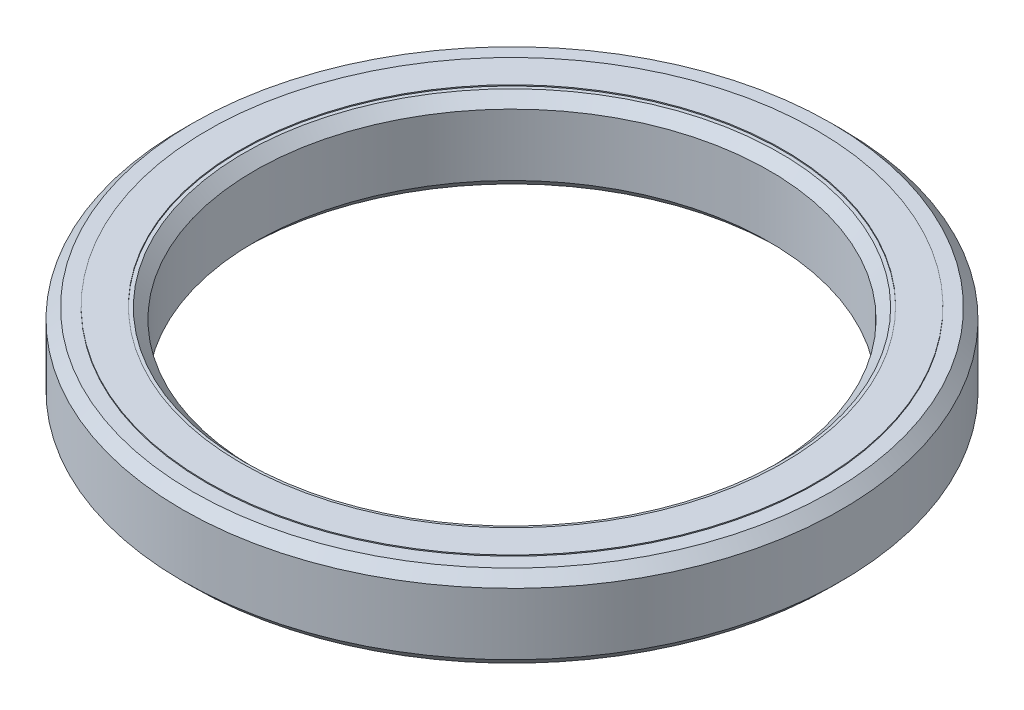
ISO-10303-21;
HEADER;
FILE_DESCRIPTION(('STEP AP214'),'2;1');
FILE_NAME('part.step','',(''),(''),'','','');
FILE_SCHEMA(('AUTOMOTIVE_DESIGN { 1 0 10303 214 1 1 1 1 }'));
ENDSEC;
DATA;
#1=APPLICATION_CONTEXT('core data for automotive mechanical design processes');
#2=APPLICATION_PROTOCOL_DEFINITION('international standard','automotive_design',2000,#1);
#3=PRODUCT_CONTEXT('',#1,'mechanical');
#4=PRODUCT('Part','Part','',(#3));
#5=PRODUCT_RELATED_PRODUCT_CATEGORY('part','',(#4));
#6=PRODUCT_DEFINITION_FORMATION('','',#4);
#7=PRODUCT_DEFINITION_CONTEXT('part definition',#1,'design');
#8=PRODUCT_DEFINITION('design','',#6,#7);
#9=PRODUCT_DEFINITION_SHAPE('','',#8);
#10=(LENGTH_UNIT() NAMED_UNIT(*) SI_UNIT(.MILLI.,.METRE.));
#11=(NAMED_UNIT(*) PLANE_ANGLE_UNIT() SI_UNIT($,.RADIAN.));
#12=(NAMED_UNIT(*) SI_UNIT($,.STERADIAN.) SOLID_ANGLE_UNIT());
#13=UNCERTAINTY_MEASURE_WITH_UNIT(LENGTH_MEASURE(1.E-05),#10,'distance_accuracy_value','');
#14=(GEOMETRIC_REPRESENTATION_CONTEXT(3) GLOBAL_UNCERTAINTY_ASSIGNED_CONTEXT((#13)) GLOBAL_UNIT_ASSIGNED_CONTEXT((#10,
#11,#12)) REPRESENTATION_CONTEXT('',''));
#15=CARTESIAN_POINT('',(0.,0.,0.));
#16=DIRECTION('',(0.,0.,1.));
#17=DIRECTION('',(1.,0.,0.));
#18=AXIS2_PLACEMENT_3D('',#15,#16,#17);
#19=CARTESIAN_POINT('',(0.,2.,0.));
#20=DIRECTION('',(0.,1.,0.));
#21=DIRECTION('',(0.,0.,1.));
#22=AXIS2_PLACEMENT_3D('',#19,#20,#21);
#23=PLANE('',#22);
#24=CARTESIAN_POINT('',(0.,2.,0.));
#25=DIRECTION('',(0.,1.,0.));
#26=DIRECTION('',(0.,0.,1.));
#27=AXIS2_PLACEMENT_3D('',#24,#25,#26);
#28=CIRCLE('',#27,14.7934604030925);
#29=CARTESIAN_POINT('',(0.,2.,14.7934604030925));
#30=VERTEX_POINT('',#29);
#31=EDGE_CURVE('E61',#30,#30,#28,.F.);
#32=ORIENTED_EDGE('',*,*,#31,.T.);
#33=EDGE_LOOP('',(#32));
#34=FACE_BOUND('',#33,.T.);
#35=CARTESIAN_POINT('',(0.,2.,0.));
#36=DIRECTION('',(0.,1.,0.));
#37=DIRECTION('',(0.,0.,1.));
#38=AXIS2_PLACEMENT_3D('',#35,#36,#37);
#39=CIRCLE('',#38,15.5);
#40=CARTESIAN_POINT('',(0.,2.,15.5));
#41=VERTEX_POINT('',#40);
#42=EDGE_CURVE('E82',#41,#41,#39,.T.);
#43=ORIENTED_EDGE('',*,*,#42,.T.);
#44=EDGE_LOOP('',(#43));
#45=FACE_BOUND('',#44,.T.);
#46=ADVANCED_FACE('F41',(#34,#45),#23,.T.);
#47=CARTESIAN_POINT('',(0.,-2.,0.));
#48=DIRECTION('',(0.,1.,0.));
#49=DIRECTION('',(0.,0.,1.));
#50=AXIS2_PLACEMENT_3D('',#47,#48,#49);
#51=PLANE('',#50);
#52=CARTESIAN_POINT('',(0.,-2.,0.));
#53=DIRECTION('',(0.,1.,0.));
#54=DIRECTION('',(0.,0.,1.));
#55=AXIS2_PLACEMENT_3D('',#52,#53,#54);
#56=CIRCLE('',#55,14.7934604030925);
#57=CARTESIAN_POINT('',(0.,-2.,14.7934604030925));
#58=VERTEX_POINT('',#57);
#59=EDGE_CURVE('E46',#58,#58,#56,.F.);
#60=ORIENTED_EDGE('',*,*,#59,.F.);
#61=EDGE_LOOP('',(#60));
#62=FACE_BOUND('',#61,.T.);
#63=CARTESIAN_POINT('',(0.,-2.,0.));
#64=DIRECTION('',(0.,1.,0.));
#65=DIRECTION('',(0.,0.,1.));
#66=AXIS2_PLACEMENT_3D('',#63,#64,#65);
#67=CIRCLE('',#66,15.5);
#68=CARTESIAN_POINT('',(0.,-2.,15.5));
#69=VERTEX_POINT('',#68);
#70=EDGE_CURVE('E65',#69,#69,#67,.F.);
#71=ORIENTED_EDGE('',*,*,#70,.T.);
#72=EDGE_LOOP('',(#71));
#73=FACE_BOUND('',#72,.T.);
#74=ADVANCED_FACE('F136',(#62,#73),#51,.F.);
#75=CARTESIAN_POINT('',(0.,2.,0.));
#76=DIRECTION('',(0.,-1.,0.));
#77=DIRECTION('',(0.,0.,-1.));
#78=AXIS2_PLACEMENT_3D('',#75,#76,#77);
#79=CYLINDRICAL_SURFACE('',#78,16.);
#80=CARTESIAN_POINT('',(0.,-1.49999999999999,0.));
#81=DIRECTION('',(0.,1.,0.));
#82=DIRECTION('',(0.,0.,1.));
#83=AXIS2_PLACEMENT_3D('',#80,#81,#82);
#84=CIRCLE('',#83,16.);
#85=CARTESIAN_POINT('',(0.,-1.49999999999999,16.));
#86=VERTEX_POINT('',#85);
#87=EDGE_CURVE('E56',#86,#86,#84,.T.);
#88=ORIENTED_EDGE('',*,*,#87,.T.);
#89=EDGE_LOOP('',(#88));
#90=FACE_BOUND('',#89,.T.);
#91=CARTESIAN_POINT('',(0.,1.49999999999999,0.));
#92=DIRECTION('',(0.,1.,0.));
#93=DIRECTION('',(0.,0.,1.));
#94=AXIS2_PLACEMENT_3D('',#91,#92,#93);
#95=CIRCLE('',#94,16.);
#96=CARTESIAN_POINT('',(0.,1.49999999999999,16.));
#97=VERTEX_POINT('',#96);
#98=EDGE_CURVE('E90',#97,#97,#95,.F.);
#99=ORIENTED_EDGE('',*,*,#98,.T.);
#100=EDGE_LOOP('',(#99));
#101=FACE_BOUND('',#100,.T.);
#102=ADVANCED_FACE('F143',(#90,#101),#79,.T.);
#103=CARTESIAN_POINT('',(0.,-1.49999999999999,0.));
#104=DIRECTION('',(0.,1.,0.));
#105=DIRECTION('',(0.,0.,1.));
#106=AXIS2_PLACEMENT_3D('',#103,#104,#105);
#107=CONICAL_SURFACE('',#106,16.,0.785398163397452);
#108=ORIENTED_EDGE('',*,*,#70,.F.);
#109=EDGE_LOOP('',(#108));
#110=FACE_BOUND('',#109,.T.);
#111=ORIENTED_EDGE('',*,*,#87,.F.);
#112=EDGE_LOOP('',(#111));
#113=FACE_BOUND('',#112,.T.);
#114=ADVANCED_FACE('F176',(#110,#113),#107,.T.);
#115=CARTESIAN_POINT('',(0.,2.,0.));
#116=DIRECTION('',(0.,-1.,0.));
#117=DIRECTION('',(0.,0.,-1.));
#118=AXIS2_PLACEMENT_3D('',#115,#116,#117);
#119=CONICAL_SURFACE('',#118,15.5,0.785398163397441);
#120=ORIENTED_EDGE('',*,*,#98,.F.);
#121=EDGE_LOOP('',(#120));
#122=FACE_BOUND('',#121,.T.);
#123=ORIENTED_EDGE('',*,*,#42,.F.);
#124=EDGE_LOOP('',(#123));
#125=FACE_BOUND('',#124,.T.);
#126=ADVANCED_FACE('F44',(#122,#125),#119,.T.);
#127=CARTESIAN_POINT('',(0.,2.05,0.));
#128=DIRECTION('',(0.,-1.,0.));
#129=DIRECTION('',(0.,0.,-1.));
#130=AXIS2_PLACEMENT_3D('',#127,#128,#129);
#131=CYLINDRICAL_SURFACE('',#130,14.7934604030925);
#132=CARTESIAN_POINT('',(0.,-2.05,0.));
#133=DIRECTION('',(0.,1.,0.));
#134=DIRECTION('',(0.,0.,1.));
#135=AXIS2_PLACEMENT_3D('',#132,#133,#134);
#136=CIRCLE('',#135,14.7934604030925);
#137=CARTESIAN_POINT('',(0.,-2.05,14.7934604030925));
#138=VERTEX_POINT('',#137);
#139=EDGE_CURVE('E59',#138,#138,#136,.T.);
#140=ORIENTED_EDGE('',*,*,#139,.T.);
#141=EDGE_LOOP('',(#140));
#142=FACE_BOUND('',#141,.T.);
#143=ORIENTED_EDGE('',*,*,#59,.T.);
#144=EDGE_LOOP('',(#143));
#145=FACE_BOUND('',#144,.T.);
#146=ADVANCED_FACE('F130',(#142,#145),#131,.T.);
#147=CARTESIAN_POINT('',(0.,-2.05,0.));
#148=DIRECTION('',(0.,1.,0.));
#149=DIRECTION('',(0.,0.,1.));
#150=AXIS2_PLACEMENT_3D('',#147,#148,#149);
#151=PLANE('',#150);
#152=ORIENTED_EDGE('',*,*,#139,.F.);
#153=EDGE_LOOP('',(#152));
#154=FACE_BOUND('',#153,.T.);
#155=CARTESIAN_POINT('',(0.,-2.05,0.));
#156=DIRECTION('',(0.,1.,0.));
#157=DIRECTION('',(0.,0.,1.));
#158=AXIS2_PLACEMENT_3D('',#155,#156,#157);
#159=CIRCLE('',#158,13.1697013532056);
#160=CARTESIAN_POINT('',(0.,-2.05,13.1697013532056));
#161=VERTEX_POINT('',#160);
#162=EDGE_CURVE('E109',#161,#161,#159,.T.);
#163=ORIENTED_EDGE('',*,*,#162,.T.);
#164=EDGE_LOOP('',(#163));
#165=FACE_BOUND('',#164,.T.);
#166=ADVANCED_FACE('F131',(#154,#165),#151,.F.);
#167=CARTESIAN_POINT('',(0.,2.05,0.));
#168=DIRECTION('',(0.,-1.,0.));
#169=DIRECTION('',(0.,0.,-1.));
#170=AXIS2_PLACEMENT_3D('',#167,#168,#169);
#171=CYLINDRICAL_SURFACE('',#170,13.1697013532056);
#172=ORIENTED_EDGE('',*,*,#162,.F.);
#173=EDGE_LOOP('',(#172));
#174=FACE_BOUND('',#173,.T.);
#175=CARTESIAN_POINT('',(0.,-2.,0.));
#176=DIRECTION('',(0.,1.,0.));
#177=DIRECTION('',(0.,0.,1.));
#178=AXIS2_PLACEMENT_3D('',#175,#176,#177);
#179=CIRCLE('',#178,13.1697013532056);
#180=CARTESIAN_POINT('',(0.,-2.,13.1697013532056));
#181=VERTEX_POINT('',#180);
#182=EDGE_CURVE('E66',#181,#181,#179,.F.);
#183=ORIENTED_EDGE('',*,*,#182,.F.);
#184=EDGE_LOOP('',(#183));
#185=FACE_BOUND('',#184,.T.);
#186=ADVANCED_FACE('F122',(#174,#185),#171,.F.);
#187=CARTESIAN_POINT('',(0.,2.05,0.));
#188=DIRECTION('',(0.,1.,0.));
#189=DIRECTION('',(0.,0.,1.));
#190=AXIS2_PLACEMENT_3D('',#187,#188,#189);
#191=PLANE('',#190);
#192=CARTESIAN_POINT('',(0.,2.05,0.));
#193=DIRECTION('',(0.,1.,0.));
#194=DIRECTION('',(0.,0.,1.));
#195=AXIS2_PLACEMENT_3D('',#192,#193,#194);
#196=CIRCLE('',#195,14.7934604030925);
#197=CARTESIAN_POINT('',(0.,2.05,14.7934604030925));
#198=VERTEX_POINT('',#197);
#199=EDGE_CURVE('E98',#198,#198,#196,.T.);
#200=ORIENTED_EDGE('',*,*,#199,.T.);
#201=EDGE_LOOP('',(#200));
#202=FACE_BOUND('',#201,.T.);
#203=CARTESIAN_POINT('',(0.,2.05,0.));
#204=DIRECTION('',(0.,1.,0.));
#205=DIRECTION('',(0.,0.,1.));
#206=AXIS2_PLACEMENT_3D('',#203,#204,#205);
#207=CIRCLE('',#206,13.1697013532056);
#208=CARTESIAN_POINT('',(0.,2.05,13.1697013532056));
#209=VERTEX_POINT('',#208);
#210=EDGE_CURVE('E107',#209,#209,#207,.T.);
#211=ORIENTED_EDGE('',*,*,#210,.F.);
#212=EDGE_LOOP('',(#211));
#213=FACE_BOUND('',#212,.T.);
#214=ADVANCED_FACE('F119',(#202,#213),#191,.T.);
#215=ORIENTED_EDGE('',*,*,#31,.F.);
#216=EDGE_LOOP('',(#215));
#217=FACE_BOUND('',#216,.T.);
#218=ORIENTED_EDGE('',*,*,#199,.F.);
#219=EDGE_LOOP('',(#218));
#220=FACE_BOUND('',#219,.T.);
#221=ADVANCED_FACE('F121',(#217,#220),#131,.T.);
#222=CARTESIAN_POINT('',(0.,2.,0.));
#223=DIRECTION('',(0.,1.,0.));
#224=DIRECTION('',(0.,0.,1.));
#225=AXIS2_PLACEMENT_3D('',#222,#223,#224);
#226=CIRCLE('',#225,13.1697013532056);
#227=CARTESIAN_POINT('',(0.,2.,13.1697013532056));
#228=VERTEX_POINT('',#227);
#229=EDGE_CURVE('E10',#228,#228,#226,.F.);
#230=ORIENTED_EDGE('',*,*,#229,.T.);
#231=EDGE_LOOP('',(#230));
#232=FACE_BOUND('',#231,.T.);
#233=ORIENTED_EDGE('',*,*,#210,.T.);
#234=EDGE_LOOP('',(#233));
#235=FACE_BOUND('',#234,.T.);
#236=ADVANCED_FACE('F117',(#232,#235),#171,.F.);
#237=CARTESIAN_POINT('',(0.,1.49999999999998,0.));
#238=DIRECTION('',(0.,1.,0.));
#239=DIRECTION('',(0.,0.,1.));
#240=AXIS2_PLACEMENT_3D('',#237,#238,#239);
#241=CONICAL_SURFACE('',#240,12.5,0.785398163397453);
#242=CARTESIAN_POINT('',(0.,2.,0.));
#243=DIRECTION('',(0.,1.,0.));
#244=DIRECTION('',(0.,0.,1.));
#245=AXIS2_PLACEMENT_3D('',#242,#243,#244);
#246=CIRCLE('',#245,13.);
#247=CARTESIAN_POINT('',(0.,2.,13.));
#248=VERTEX_POINT('',#247);
#249=EDGE_CURVE('E86',#248,#248,#246,.F.);
#250=CARTESIAN_POINT('',(0.,1.49999999999998,0.));
#251=DIRECTION('',(0.,1.,0.));
#252=DIRECTION('',(0.,0.,1.));
#253=AXIS2_PLACEMENT_3D('',#250,#251,#252);
#254=CIRCLE('',#253,12.5);
#255=CARTESIAN_POINT('',(0.,1.49999999999998,12.5));
#256=VERTEX_POINT('',#255);
#257=EDGE_CURVE('E74',#256,#256,#254,.T.);
#258=CARTESIAN_POINT('',(0.,2.,13.));
#259=CARTESIAN_POINT('',(0.,1.99479166666667,12.9947916666667));
#260=CARTESIAN_POINT('',(0.,1.98958333333333,12.9895833333334));
#261=CARTESIAN_POINT('',(0.,1.97916666666667,12.9791666666667));
#262=CARTESIAN_POINT('',(0.,1.97395833333333,12.9739583333334));
#263=CARTESIAN_POINT('',(0.,1.96354166666667,12.9635416666667));
#264=CARTESIAN_POINT('',(0.,1.95833333333333,12.9583333333334));
#265=CARTESIAN_POINT('',(0.,1.94791666666666,12.9479166666667));
#266=CARTESIAN_POINT('',(0.,1.94270833333333,12.9427083333334));
#267=CARTESIAN_POINT('',(0.,1.93229166666666,12.9322916666667));
#268=CARTESIAN_POINT('',(0.,1.92708333333333,12.9270833333334));
#269=CARTESIAN_POINT('',(0.,1.91666666666666,12.9166666666667));
#270=CARTESIAN_POINT('',(0.,1.91145833333333,12.9114583333334));
#271=CARTESIAN_POINT('',(0.,1.90104166666666,12.9010416666667));
#272=CARTESIAN_POINT('',(0.,1.89583333333333,12.8958333333334));
#273=CARTESIAN_POINT('',(0.,1.88541666666666,12.8854166666667));
#274=CARTESIAN_POINT('',(0.,1.88020833333333,12.8802083333334));
#275=CARTESIAN_POINT('',(0.,1.86979166666666,12.8697916666667));
#276=CARTESIAN_POINT('',(0.,1.86458333333333,12.8645833333334));
#277=CARTESIAN_POINT('',(0.,1.85416666666666,12.8541666666667));
#278=CARTESIAN_POINT('',(0.,1.84895833333333,12.8489583333334));
#279=CARTESIAN_POINT('',(0.,1.83854166666666,12.8385416666667));
#280=CARTESIAN_POINT('',(0.,1.83333333333333,12.8333333333334));
#281=CARTESIAN_POINT('',(0.,1.82291666666666,12.8229166666667));
#282=CARTESIAN_POINT('',(0.,1.81770833333333,12.8177083333333));
#283=CARTESIAN_POINT('',(0.,1.80729166666666,12.8072916666667));
#284=CARTESIAN_POINT('',(0.,1.80208333333333,12.8020833333333));
#285=CARTESIAN_POINT('',(0.,1.79166666666666,12.7916666666667));
#286=CARTESIAN_POINT('',(0.,1.78645833333332,12.7864583333333));
#287=CARTESIAN_POINT('',(0.,1.77604166666666,12.7760416666667));
#288=CARTESIAN_POINT('',(0.,1.77083333333332,12.7708333333333));
#289=CARTESIAN_POINT('',(0.,1.76041666666666,12.7604166666667));
#290=CARTESIAN_POINT('',(0.,1.75520833333332,12.7552083333333));
#291=CARTESIAN_POINT('',(0.,1.74479166666666,12.7447916666667));
#292=CARTESIAN_POINT('',(0.,1.73958333333332,12.7395833333333));
#293=CARTESIAN_POINT('',(0.,1.72916666666666,12.7291666666667));
#294=CARTESIAN_POINT('',(0.,1.72395833333332,12.7239583333333));
#295=CARTESIAN_POINT('',(0.,1.71354166666666,12.7135416666667));
#296=CARTESIAN_POINT('',(0.,1.70833333333332,12.7083333333333));
#297=CARTESIAN_POINT('',(0.,1.69791666666665,12.6979166666667));
#298=CARTESIAN_POINT('',(0.,1.69270833333332,12.6927083333333));
#299=CARTESIAN_POINT('',(0.,1.68229166666665,12.6822916666667));
#300=CARTESIAN_POINT('',(0.,1.67708333333332,12.6770833333333));
#301=CARTESIAN_POINT('',(0.,1.66666666666665,12.6666666666667));
#302=CARTESIAN_POINT('',(0.,1.66145833333332,12.6614583333333));
#303=CARTESIAN_POINT('',(0.,1.65104166666665,12.6510416666667));
#304=CARTESIAN_POINT('',(0.,1.64583333333332,12.6458333333333));
#305=CARTESIAN_POINT('',(0.,1.63541666666665,12.6354166666667));
#306=CARTESIAN_POINT('',(0.,1.63020833333332,12.6302083333333));
#307=CARTESIAN_POINT('',(0.,1.61979166666665,12.6197916666667));
#308=CARTESIAN_POINT('',(0.,1.61458333333332,12.6145833333333));
#309=CARTESIAN_POINT('',(0.,1.60416666666665,12.6041666666667));
#310=CARTESIAN_POINT('',(0.,1.59895833333332,12.5989583333333));
#311=CARTESIAN_POINT('',(0.,1.58854166666665,12.5885416666667));
#312=CARTESIAN_POINT('',(0.,1.58333333333332,12.5833333333333));
#313=CARTESIAN_POINT('',(0.,1.57291666666665,12.5729166666667));
#314=CARTESIAN_POINT('',(0.,1.56770833333332,12.5677083333333));
#315=CARTESIAN_POINT('',(0.,1.55729166666665,12.5572916666667));
#316=CARTESIAN_POINT('',(0.,1.55208333333332,12.5520833333333));
#317=CARTESIAN_POINT('',(0.,1.54166666666665,12.5416666666667));
#318=CARTESIAN_POINT('',(0.,1.53645833333332,12.5364583333333));
#319=CARTESIAN_POINT('',(0.,1.52604166666665,12.5260416666667));
#320=CARTESIAN_POINT('',(0.,1.52083333333331,12.5208333333333));
#321=CARTESIAN_POINT('',(0.,1.51041666666665,12.5104166666667));
#322=CARTESIAN_POINT('',(0.,1.50520833333331,12.5052083333333));
#323=CARTESIAN_POINT('',(0.,1.49999999999998,12.5));
#324=B_SPLINE_CURVE_WITH_KNOTS('',3,(#258,#259,#260,#261,#262,#263,#264,#265,#266,#267,#268,
#269,#270,#271,#272,#273,#274,#275,#276,#277,#278,#279,#280,#281,#282,#283,#284,#285,#286,#287,
#288,#289,#290,#291,#292,#293,#294,#295,#296,#297,#298,#299,#300,#301,#302,#303,#304,#305,#306,
#307,#308,#309,#310,#311,#312,#313,#314,#315,#316,#317,#318,#319,#320,#321,#322,#323),
.UNSPECIFIED.,.F.,.F.,(4,2,2,2,2,2,2,2,2,2,2,2,2,2,2,2,2,2,2,2,2,2,2,2,2,2,2,2,2,2,2,2,4),(0.,
0.0220970869120812,0.0441941738241611,0.0662912607362413,0.0883883476483225,0.110485434560403,
0.132582521472484,0.154679608384564,0.176776695296645,0.198873782208725,0.220970869120805,
0.243067956032887,0.265165042944967,0.287262129857048,0.309359216769128,0.331456303681209,
0.353553390593289,0.375650477505371,0.39774756441745,0.419844651329531,0.441941738241612,
0.464038825153692,0.486135912065773,0.508232998977853,0.530330085889934,0.552427172802014,
0.574524259714094,0.596621346626176,0.618718433538256,0.640815520450337,0.662912607362417,
0.685009694274498,0.707106781186578),.UNSPECIFIED.);
#325=EDGE_CURVE('BSEAM151',#248,#256,#324,.T.);
#326=ORIENTED_EDGE('',*,*,#249,.F.);
#327=ORIENTED_EDGE('',*,*,#257,.F.);
#328=ORIENTED_EDGE('',*,*,#325,.T.);
#329=ORIENTED_EDGE('',*,*,#325,.F.);
#330=EDGE_LOOP('',(#326,#328,#327,#329));
#331=FACE_BOUND('',#330,.T.);
#332=ADVANCED_FACE('F151',(#331),#241,.F.);
#333=ORIENTED_EDGE('',*,*,#249,.T.);
#334=EDGE_LOOP('',(#333));
#335=FACE_BOUND('',#334,.T.);
#336=ORIENTED_EDGE('',*,*,#229,.F.);
#337=EDGE_LOOP('',(#336));
#338=FACE_BOUND('',#337,.T.);
#339=ADVANCED_FACE('F139',(#335,#338),#23,.T.);
#340=CARTESIAN_POINT('',(0.,2.,0.));
#341=DIRECTION('',(0.,-1.,0.));
#342=DIRECTION('',(0.,0.,-1.));
#343=AXIS2_PLACEMENT_3D('',#340,#341,#342);
#344=CYLINDRICAL_SURFACE('',#343,12.5);
#345=CARTESIAN_POINT('',(0.,-1.5,0.));
#346=DIRECTION('',(0.,1.,0.));
#347=DIRECTION('',(0.,0.,1.));
#348=AXIS2_PLACEMENT_3D('',#345,#346,#347);
#349=CIRCLE('',#348,12.5);
#350=CARTESIAN_POINT('',(0.,-1.5,12.5));
#351=VERTEX_POINT('',#350);
#352=EDGE_CURVE('E78',#351,#351,#349,.F.);
#353=ORIENTED_EDGE('',*,*,#352,.T.);
#354=EDGE_LOOP('',(#353));
#355=FACE_BOUND('',#354,.T.);
#356=ORIENTED_EDGE('',*,*,#257,.T.);
#357=EDGE_LOOP('',(#356));
#358=FACE_BOUND('',#357,.T.);
#359=ADVANCED_FACE('F150',(#355,#358),#344,.F.);
#360=CARTESIAN_POINT('',(0.,-2.,0.));
#361=DIRECTION('',(0.,-1.,0.));
#362=DIRECTION('',(0.,0.,-1.));
#363=AXIS2_PLACEMENT_3D('',#360,#361,#362);
#364=CONICAL_SURFACE('',#363,13.,0.78539816339744);
#365=ORIENTED_EDGE('',*,*,#352,.F.);
#366=EDGE_LOOP('',(#365));
#367=FACE_BOUND('',#366,.T.);
#368=CARTESIAN_POINT('',(0.,-2.,0.));
#369=DIRECTION('',(0.,1.,0.));
#370=DIRECTION('',(0.,0.,1.));
#371=AXIS2_PLACEMENT_3D('',#368,#369,#370);
#372=CIRCLE('',#371,13.);
#373=CARTESIAN_POINT('',(0.,-2.,13.));
#374=VERTEX_POINT('',#373);
#375=EDGE_CURVE('E70',#374,#374,#372,.T.);
#376=ORIENTED_EDGE('',*,*,#375,.F.);
#377=EDGE_LOOP('',(#376));
#378=FACE_BOUND('',#377,.T.);
#379=ADVANCED_FACE('F157',(#367,#378),#364,.F.);
#380=ORIENTED_EDGE('',*,*,#375,.T.);
#381=EDGE_LOOP('',(#380));
#382=FACE_BOUND('',#381,.T.);
#383=ORIENTED_EDGE('',*,*,#182,.T.);
#384=EDGE_LOOP('',(#383));
#385=FACE_BOUND('',#384,.T.);
#386=ADVANCED_FACE('F146',(#382,#385),#51,.F.);
#387=CLOSED_SHELL('',(#46,#74,#102,#114,#126,#146,#166,#186,#214,#221,#236,#332,#339,#359,#379,#386));
#388=MANIFOLD_SOLID_BREP('B2',#387);
#389=ADVANCED_BREP_SHAPE_REPRESENTATION('',(#18,#388),#14);
#390=SHAPE_DEFINITION_REPRESENTATION(#9,#389);
ENDSEC;
END-ISO-10303-21;
